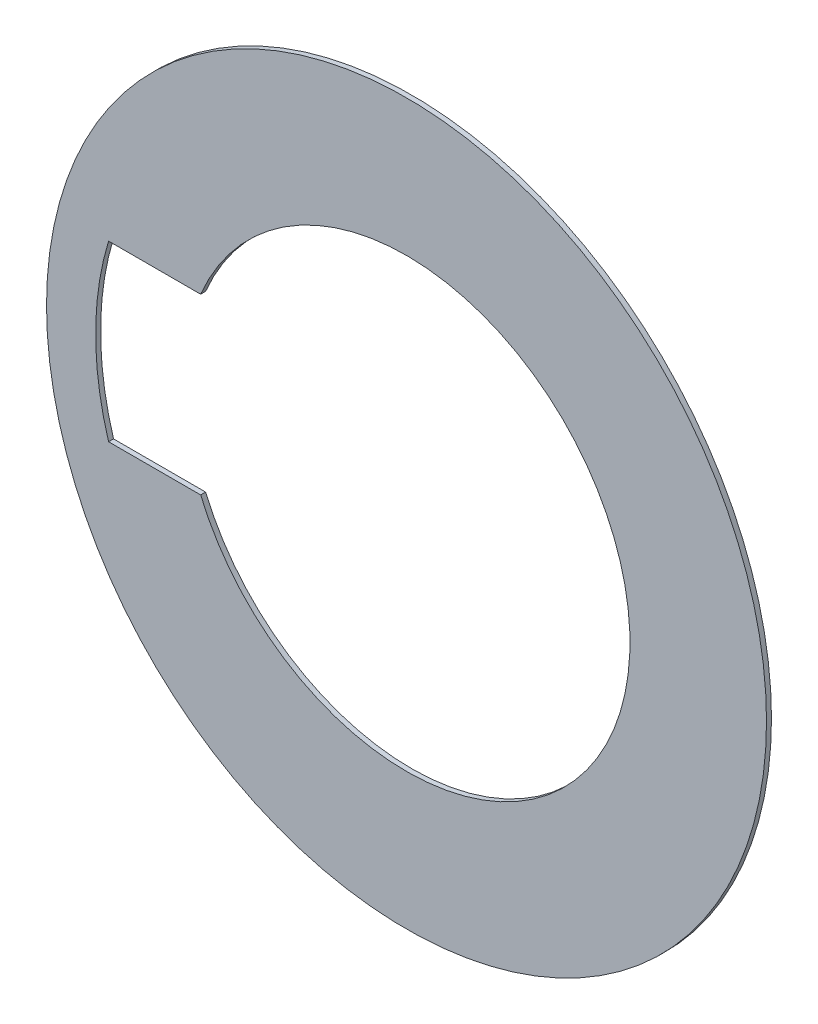
ISO-10303-21;
HEADER;
FILE_DESCRIPTION(('STEP AP214'),'2;1');
FILE_NAME('part.step','',(''),(''),'','','');
FILE_SCHEMA(('AUTOMOTIVE_DESIGN { 1 0 10303 214 1 1 1 1 }'));
ENDSEC;
DATA;
#1=APPLICATION_CONTEXT('core data for automotive mechanical design processes');
#2=APPLICATION_PROTOCOL_DEFINITION('international standard','automotive_design',2000,#1);
#3=PRODUCT_CONTEXT('',#1,'mechanical');
#4=PRODUCT('Part','Part','',(#3));
#5=PRODUCT_RELATED_PRODUCT_CATEGORY('part','',(#4));
#6=PRODUCT_DEFINITION_FORMATION('','',#4);
#7=PRODUCT_DEFINITION_CONTEXT('part definition',#1,'design');
#8=PRODUCT_DEFINITION('design','',#6,#7);
#9=PRODUCT_DEFINITION_SHAPE('','',#8);
#10=(LENGTH_UNIT() NAMED_UNIT(*) SI_UNIT(.MILLI.,.METRE.));
#11=(NAMED_UNIT(*) PLANE_ANGLE_UNIT() SI_UNIT($,.RADIAN.));
#12=(NAMED_UNIT(*) SI_UNIT($,.STERADIAN.) SOLID_ANGLE_UNIT());
#13=UNCERTAINTY_MEASURE_WITH_UNIT(LENGTH_MEASURE(1.E-05),#10,'distance_accuracy_value','');
#14=(GEOMETRIC_REPRESENTATION_CONTEXT(3) GLOBAL_UNCERTAINTY_ASSIGNED_CONTEXT((#13)) GLOBAL_UNIT_ASSIGNED_CONTEXT((#10,
#11,#12)) REPRESENTATION_CONTEXT('',''));
#15=CARTESIAN_POINT('',(0.,0.,0.));
#16=DIRECTION('',(0.,0.,1.));
#17=DIRECTION('',(1.,0.,0.));
#18=AXIS2_PLACEMENT_3D('',#15,#16,#17);
#19=CARTESIAN_POINT('',(0.,0.,2.54));
#20=DIRECTION('',(0.,0.,-1.));
#21=DIRECTION('',(-1.,0.,0.));
#22=AXIS2_PLACEMENT_3D('',#19,#20,#21);
#23=CYLINDRICAL_SURFACE('',#22,184.15);
#24=CARTESIAN_POINT('',(0.,0.,2.54));
#25=DIRECTION('',(0.,0.,1.));
#26=DIRECTION('',(1.,0.,0.));
#27=AXIS2_PLACEMENT_3D('',#24,#25,#26);
#28=CIRCLE('',#27,184.15);
#29=CARTESIAN_POINT('',(184.15,0.,2.54));
#30=VERTEX_POINT('',#29);
#31=EDGE_CURVE('E13',#30,#30,#28,.T.);
#32=ORIENTED_EDGE('',*,*,#31,.F.);
#33=EDGE_LOOP('',(#32));
#34=FACE_BOUND('',#33,.T.);
#35=CARTESIAN_POINT('',(0.,0.,0.));
#36=DIRECTION('',(0.,0.,1.));
#37=DIRECTION('',(1.,0.,0.));
#38=AXIS2_PLACEMENT_3D('',#35,#36,#37);
#39=CIRCLE('',#38,184.15);
#40=CARTESIAN_POINT('',(184.15,0.,0.));
#41=VERTEX_POINT('',#40);
#42=EDGE_CURVE('E65',#41,#41,#39,.T.);
#43=ORIENTED_EDGE('',*,*,#42,.T.);
#44=EDGE_LOOP('',(#43));
#45=FACE_BOUND('',#44,.T.);
#46=ADVANCED_FACE('F56',(#34,#45),#23,.T.);
#47=CARTESIAN_POINT('',(0.,0.,2.54));
#48=DIRECTION('',(0.,0.,1.));
#49=DIRECTION('',(1.,0.,0.));
#50=AXIS2_PLACEMENT_3D('',#47,#48,#49);
#51=PLANE('',#50);
#52=CARTESIAN_POINT('',(0.,0.,2.54));
#53=DIRECTION('',(0.,0.,1.));
#54=DIRECTION('',(1.,0.,0.));
#55=AXIS2_PLACEMENT_3D('',#52,#53,#54);
#56=CIRCLE('',#55,114.3);
#57=CARTESIAN_POINT('',(-105.302837093784,-44.45,2.54));
#58=VERTEX_POINT('',#57);
#59=CARTESIAN_POINT('',(-105.302837093784,44.45,2.54));
#60=VERTEX_POINT('',#59);
#61=EDGE_CURVE('E59',#58,#60,#56,.T.);
#62=ORIENTED_EDGE('',*,*,#61,.F.);
#63=DIRECTION('',(1.,0.,0.));
#64=VECTOR('',#63,1.);
#65=CARTESIAN_POINT('',(-105.302837093784,-44.45,2.54));
#66=LINE('',#65,#64);
#67=CARTESIAN_POINT('',(-152.4,-44.45,2.54));
#68=VERTEX_POINT('',#67);
#69=EDGE_CURVE('E112',#68,#58,#66,.T.);
#70=ORIENTED_EDGE('',*,*,#69,.F.);
#71=CARTESIAN_POINT('',(-6.62634840273774,0.,2.54));
#72=DIRECTION('',(0.,0.,1.));
#73=DIRECTION('',(1.,0.,0.));
#74=AXIS2_PLACEMENT_3D('',#71,#72,#73);
#75=CIRCLE('',#74,152.4);
#76=CARTESIAN_POINT('',(-152.4,44.45,2.54));
#77=VERTEX_POINT('',#76);
#78=EDGE_CURVE('E101',#77,#68,#75,.T.);
#79=ORIENTED_EDGE('',*,*,#78,.F.);
#80=DIRECTION('',(-1.,0.,0.));
#81=VECTOR('',#80,1.);
#82=CARTESIAN_POINT('',(-105.302837093784,44.45,2.54));
#83=LINE('',#82,#81);
#84=EDGE_CURVE('E113',#60,#77,#83,.T.);
#85=ORIENTED_EDGE('',*,*,#84,.F.);
#86=EDGE_LOOP('',(#62,#70,#79,#85));
#87=FACE_BOUND('',#86,.T.);
#88=ORIENTED_EDGE('',*,*,#31,.T.);
#89=EDGE_LOOP('',(#88));
#90=FACE_BOUND('',#89,.T.);
#91=ADVANCED_FACE('F125',(#87,#90),#51,.T.);
#92=CARTESIAN_POINT('',(0.,0.,0.));
#93=DIRECTION('',(0.,0.,1.));
#94=DIRECTION('',(1.,0.,0.));
#95=AXIS2_PLACEMENT_3D('',#92,#93,#94);
#96=PLANE('',#95);
#97=DIRECTION('',(1.,0.,0.));
#98=VECTOR('',#97,1.);
#99=CARTESIAN_POINT('',(-105.302837093784,-44.45,0.));
#100=LINE('',#99,#98);
#101=CARTESIAN_POINT('',(-152.4,-44.45,0.));
#102=VERTEX_POINT('',#101);
#103=CARTESIAN_POINT('',(-105.302837093784,-44.45,0.));
#104=VERTEX_POINT('',#103);
#105=EDGE_CURVE('E120',#102,#104,#100,.T.);
#106=ORIENTED_EDGE('',*,*,#105,.T.);
#107=CARTESIAN_POINT('',(0.,0.,0.));
#108=DIRECTION('',(0.,0.,1.));
#109=DIRECTION('',(1.,0.,0.));
#110=AXIS2_PLACEMENT_3D('',#107,#108,#109);
#111=CIRCLE('',#110,114.3);
#112=CARTESIAN_POINT('',(-105.302837093784,44.45,0.));
#113=VERTEX_POINT('',#112);
#114=EDGE_CURVE('E152',#104,#113,#111,.T.);
#115=ORIENTED_EDGE('',*,*,#114,.T.);
#116=DIRECTION('',(-1.,0.,0.));
#117=VECTOR('',#116,1.);
#118=CARTESIAN_POINT('',(-105.302837093784,44.45,0.));
#119=LINE('',#118,#117);
#120=CARTESIAN_POINT('',(-152.4,44.45,0.));
#121=VERTEX_POINT('',#120);
#122=EDGE_CURVE('E148',#113,#121,#119,.T.);
#123=ORIENTED_EDGE('',*,*,#122,.T.);
#124=CARTESIAN_POINT('',(-6.62634840273774,0.,0.));
#125=DIRECTION('',(0.,0.,1.));
#126=DIRECTION('',(1.,0.,0.));
#127=AXIS2_PLACEMENT_3D('',#124,#125,#126);
#128=CIRCLE('',#127,152.4);
#129=EDGE_CURVE('E87',#121,#102,#128,.T.);
#130=ORIENTED_EDGE('',*,*,#129,.T.);
#131=EDGE_LOOP('',(#106,#115,#123,#130));
#132=FACE_BOUND('',#131,.T.);
#133=ORIENTED_EDGE('',*,*,#42,.F.);
#134=EDGE_LOOP('',(#133));
#135=FACE_BOUND('',#134,.T.);
#136=ADVANCED_FACE('F159',(#132,#135),#96,.F.);
#137=CARTESIAN_POINT('',(0.,0.,0.));
#138=DIRECTION('',(0.,0.,1.));
#139=DIRECTION('',(1.,0.,0.));
#140=AXIS2_PLACEMENT_3D('',#137,#138,#139);
#141=CYLINDRICAL_SURFACE('',#140,114.3);
#142=ORIENTED_EDGE('',*,*,#61,.T.);
#143=DIRECTION('',(0.,0.,1.));
#144=VECTOR('',#143,1.);
#145=CARTESIAN_POINT('',(-105.302837093784,44.45,0.));
#146=LINE('',#145,#144);
#147=EDGE_CURVE('E75',#113,#60,#146,.T.);
#148=ORIENTED_EDGE('',*,*,#147,.F.);
#149=ORIENTED_EDGE('',*,*,#114,.F.);
#150=DIRECTION('',(0.,0.,1.));
#151=VECTOR('',#150,1.);
#152=CARTESIAN_POINT('',(-105.302837093784,-44.45,0.));
#153=LINE('',#152,#151);
#154=EDGE_CURVE('E122',#104,#58,#153,.T.);
#155=ORIENTED_EDGE('',*,*,#154,.T.);
#156=EDGE_LOOP('',(#142,#148,#149,#155));
#157=FACE_BOUND('',#156,.T.);
#158=ADVANCED_FACE('F163',(#157),#141,.F.);
#159=CARTESIAN_POINT('',(-105.302837093784,-44.45,0.));
#160=DIRECTION('',(0.,-1.,0.));
#161=DIRECTION('',(1.,0.,0.));
#162=AXIS2_PLACEMENT_3D('',#159,#160,#161);
#163=PLANE('',#162);
#164=ORIENTED_EDGE('',*,*,#69,.T.);
#165=ORIENTED_EDGE('',*,*,#154,.F.);
#166=ORIENTED_EDGE('',*,*,#105,.F.);
#167=DIRECTION('',(0.,0.,1.));
#168=VECTOR('',#167,1.);
#169=CARTESIAN_POINT('',(-152.4,-44.45,0.));
#170=LINE('',#169,#168);
#171=EDGE_CURVE('E105',#102,#68,#170,.T.);
#172=ORIENTED_EDGE('',*,*,#171,.T.);
#173=EDGE_LOOP('',(#164,#165,#166,#172));
#174=FACE_BOUND('',#173,.T.);
#175=ADVANCED_FACE('F116',(#174),#163,.F.);
#176=CARTESIAN_POINT('',(-6.62634840273774,0.,0.));
#177=DIRECTION('',(0.,0.,1.));
#178=DIRECTION('',(1.,0.,0.));
#179=AXIS2_PLACEMENT_3D('',#176,#177,#178);
#180=CYLINDRICAL_SURFACE('',#179,152.4);
#181=ORIENTED_EDGE('',*,*,#78,.T.);
#182=ORIENTED_EDGE('',*,*,#171,.F.);
#183=ORIENTED_EDGE('',*,*,#129,.F.);
#184=DIRECTION('',(0.,0.,1.));
#185=VECTOR('',#184,1.);
#186=CARTESIAN_POINT('',(-152.4,44.45,0.));
#187=LINE('',#186,#185);
#188=EDGE_CURVE('E107',#121,#77,#187,.T.);
#189=ORIENTED_EDGE('',*,*,#188,.T.);
#190=EDGE_LOOP('',(#181,#182,#183,#189));
#191=FACE_BOUND('',#190,.T.);
#192=ADVANCED_FACE('F103',(#191),#180,.F.);
#193=CARTESIAN_POINT('',(-105.302837093784,44.45,0.));
#194=DIRECTION('',(0.,1.,0.));
#195=DIRECTION('',(-1.,0.,0.));
#196=AXIS2_PLACEMENT_3D('',#193,#194,#195);
#197=PLANE('',#196);
#198=ORIENTED_EDGE('',*,*,#84,.T.);
#199=ORIENTED_EDGE('',*,*,#188,.F.);
#200=ORIENTED_EDGE('',*,*,#122,.F.);
#201=ORIENTED_EDGE('',*,*,#147,.T.);
#202=EDGE_LOOP('',(#198,#199,#200,#201));
#203=FACE_BOUND('',#202,.T.);
#204=ADVANCED_FACE('F165',(#203),#197,.F.);
#205=CLOSED_SHELL('',(#46,#91,#136,#158,#175,#192,#204));
#206=MANIFOLD_SOLID_BREP('B2',#205);
#207=ADVANCED_BREP_SHAPE_REPRESENTATION('',(#18,#206),#14);
#208=SHAPE_DEFINITION_REPRESENTATION(#9,#207);
ENDSEC;
END-ISO-10303-21;
